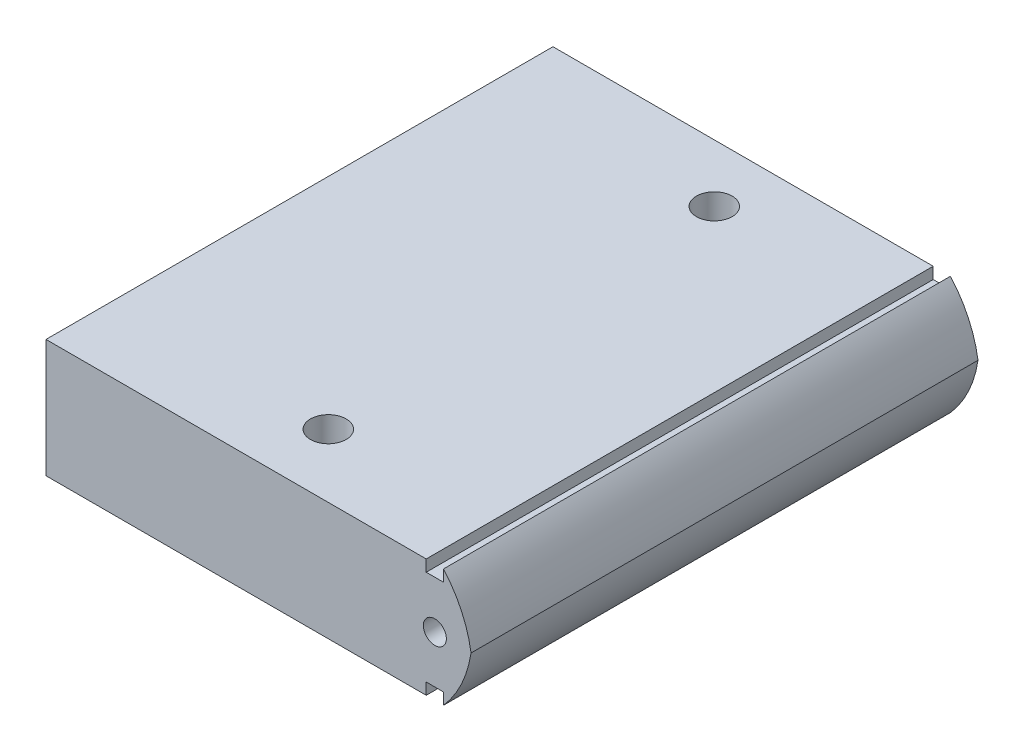
ISO-10303-21;
HEADER;
FILE_DESCRIPTION(('STEP AP214'),'2;1');
FILE_NAME('part.step','',(''),(''),'','','');
FILE_SCHEMA(('AUTOMOTIVE_DESIGN { 1 0 10303 214 1 1 1 1 }'));
ENDSEC;
DATA;
#1=APPLICATION_CONTEXT('core data for automotive mechanical design processes');
#2=APPLICATION_PROTOCOL_DEFINITION('international standard','automotive_design',2000,#1);
#3=PRODUCT_CONTEXT('',#1,'mechanical');
#4=PRODUCT('Part','Part','',(#3));
#5=PRODUCT_RELATED_PRODUCT_CATEGORY('part','',(#4));
#6=PRODUCT_DEFINITION_FORMATION('','',#4);
#7=PRODUCT_DEFINITION_CONTEXT('part definition',#1,'design');
#8=PRODUCT_DEFINITION('design','',#6,#7);
#9=PRODUCT_DEFINITION_SHAPE('','',#8);
#10=(LENGTH_UNIT() NAMED_UNIT(*) SI_UNIT(.MILLI.,.METRE.));
#11=(NAMED_UNIT(*) PLANE_ANGLE_UNIT() SI_UNIT($,.RADIAN.));
#12=(NAMED_UNIT(*) SI_UNIT($,.STERADIAN.) SOLID_ANGLE_UNIT());
#13=UNCERTAINTY_MEASURE_WITH_UNIT(LENGTH_MEASURE(1.E-05),#10,'distance_accuracy_value','');
#14=(GEOMETRIC_REPRESENTATION_CONTEXT(3) GLOBAL_UNCERTAINTY_ASSIGNED_CONTEXT((#13)) GLOBAL_UNIT_ASSIGNED_CONTEXT((#10,
#11,#12)) REPRESENTATION_CONTEXT('',''));
#15=CARTESIAN_POINT('',(0.,0.,0.));
#16=DIRECTION('',(0.,0.,1.));
#17=DIRECTION('',(1.,0.,0.));
#18=AXIS2_PLACEMENT_3D('',#15,#16,#17);
#19=CARTESIAN_POINT('',(0.,10.25,0.));
#20=DIRECTION('',(0.,-1.,0.));
#21=DIRECTION('',(0.,0.,-1.));
#22=AXIS2_PLACEMENT_3D('',#19,#20,#21);
#23=PLANE('',#22);
#24=CARTESIAN_POINT('',(19.,10.25,-5.50000000000001));
#25=DIRECTION('',(0.,1.,0.));
#26=DIRECTION('',(0.,0.,1.));
#27=AXIS2_PLACEMENT_3D('',#24,#25,#26);
#28=CIRCLE('',#27,1.55);
#29=CARTESIAN_POINT('',(19.,10.25,-3.95000000000001));
#30=VERTEX_POINT('',#29);
#31=EDGE_CURVE('E234',#30,#30,#28,.T.);
#32=ORIENTED_EDGE('',*,*,#31,.F.);
#33=EDGE_LOOP('',(#32));
#34=FACE_BOUND('',#33,.T.);
#35=CARTESIAN_POINT('',(19.,10.25,-39.));
#36=DIRECTION('',(0.,1.,0.));
#37=DIRECTION('',(0.,0.,1.));
#38=AXIS2_PLACEMENT_3D('',#35,#36,#37);
#39=CIRCLE('',#38,1.55);
#40=CARTESIAN_POINT('',(19.,10.25,-37.45));
#41=VERTEX_POINT('',#40);
#42=EDGE_CURVE('E242',#41,#41,#39,.T.);
#43=ORIENTED_EDGE('',*,*,#42,.F.);
#44=EDGE_LOOP('',(#43));
#45=FACE_BOUND('',#44,.T.);
#46=DIRECTION('',(1.,0.,0.));
#47=VECTOR('',#46,1.);
#48=CARTESIAN_POINT('',(0.,10.25,0.));
#49=LINE('',#48,#47);
#50=CARTESIAN_POINT('',(0.,10.25,0.));
#51=VERTEX_POINT('',#50);
#52=CARTESIAN_POINT('',(33.,10.25,0.));
#53=VERTEX_POINT('',#52);
#54=EDGE_CURVE('E257',#51,#53,#49,.T.);
#55=ORIENTED_EDGE('',*,*,#54,.T.);
#56=DIRECTION('',(0.,0.,1.));
#57=VECTOR('',#56,1.);
#58=CARTESIAN_POINT('',(33.,10.25,-44.));
#59=LINE('',#58,#57);
#60=CARTESIAN_POINT('',(33.,10.25,-44.));
#61=VERTEX_POINT('',#60);
#62=EDGE_CURVE('E209',#61,#53,#59,.T.);
#63=ORIENTED_EDGE('',*,*,#62,.F.);
#64=DIRECTION('',(-1.,0.,0.));
#65=VECTOR('',#64,1.);
#66=CARTESIAN_POINT('',(0.,10.25,-44.));
#67=LINE('',#66,#65);
#68=CARTESIAN_POINT('',(0.,10.25,-44.));
#69=VERTEX_POINT('',#68);
#70=EDGE_CURVE('E261',#61,#69,#67,.T.);
#71=ORIENTED_EDGE('',*,*,#70,.T.);
#72=DIRECTION('',(0.,0.,1.));
#73=VECTOR('',#72,1.);
#74=CARTESIAN_POINT('',(0.,10.25,0.));
#75=LINE('',#74,#73);
#76=EDGE_CURVE('E254',#69,#51,#75,.T.);
#77=ORIENTED_EDGE('',*,*,#76,.T.);
#78=EDGE_LOOP('',(#55,#63,#71,#77));
#79=FACE_BOUND('',#78,.T.);
#80=ADVANCED_FACE('F33',(#34,#45,#79),#23,.F.);
#81=CARTESIAN_POINT('',(0.,10.25,0.));
#82=DIRECTION('',(1.,0.,0.));
#83=DIRECTION('',(0.,0.,-1.));
#84=AXIS2_PLACEMENT_3D('',#81,#82,#83);
#85=PLANE('',#84);
#86=DIRECTION('',(0.,0.,1.));
#87=VECTOR('',#86,1.);
#88=CARTESIAN_POINT('',(0.,4.25,-34.));
#89=LINE('',#88,#87);
#90=CARTESIAN_POINT('',(0.,4.25,-34.));
#91=VERTEX_POINT('',#90);
#92=CARTESIAN_POINT('',(0.,4.25,-12.));
#93=VERTEX_POINT('',#92);
#94=EDGE_CURVE('E173',#91,#93,#89,.T.);
#95=ORIENTED_EDGE('',*,*,#94,.F.);
#96=DIRECTION('',(0.,-1.,0.));
#97=VECTOR('',#96,1.);
#98=CARTESIAN_POINT('',(0.,9.25,-34.));
#99=LINE('',#98,#97);
#100=CARTESIAN_POINT('',(0.,9.25,-34.));
#101=VERTEX_POINT('',#100);
#102=EDGE_CURVE('E147',#101,#91,#99,.T.);
#103=ORIENTED_EDGE('',*,*,#102,.F.);
#104=DIRECTION('',(0.,0.,-1.));
#105=VECTOR('',#104,1.);
#106=CARTESIAN_POINT('',(0.,9.25,-34.));
#107=LINE('',#106,#105);
#108=CARTESIAN_POINT('',(0.,9.25,-12.));
#109=VERTEX_POINT('',#108);
#110=EDGE_CURVE('E164',#109,#101,#107,.T.);
#111=ORIENTED_EDGE('',*,*,#110,.F.);
#112=DIRECTION('',(0.,1.,0.));
#113=VECTOR('',#112,1.);
#114=CARTESIAN_POINT('',(0.,9.25,-12.));
#115=LINE('',#114,#113);
#116=EDGE_CURVE('E167',#93,#109,#115,.T.);
#117=ORIENTED_EDGE('',*,*,#116,.F.);
#118=EDGE_LOOP('',(#95,#103,#111,#117));
#119=FACE_BOUND('',#118,.T.);
#120=DIRECTION('',(0.,0.,1.));
#121=VECTOR('',#120,1.);
#122=CARTESIAN_POINT('',(0.,0.,0.));
#123=LINE('',#122,#121);
#124=CARTESIAN_POINT('',(0.,0.,-44.));
#125=VERTEX_POINT('',#124);
#126=CARTESIAN_POINT('',(0.,0.,0.));
#127=VERTEX_POINT('',#126);
#128=EDGE_CURVE('E249',#125,#127,#123,.T.);
#129=ORIENTED_EDGE('',*,*,#128,.T.);
#130=DIRECTION('',(0.,-1.,0.));
#131=VECTOR('',#130,1.);
#132=CARTESIAN_POINT('',(0.,10.25,0.));
#133=LINE('',#132,#131);
#134=EDGE_CURVE('E272',#51,#127,#133,.T.);
#135=ORIENTED_EDGE('',*,*,#134,.F.);
#136=ORIENTED_EDGE('',*,*,#76,.F.);
#137=DIRECTION('',(0.,-1.,0.));
#138=VECTOR('',#137,1.);
#139=CARTESIAN_POINT('',(0.,10.25,-44.));
#140=LINE('',#139,#138);
#141=EDGE_CURVE('E263',#69,#125,#140,.T.);
#142=ORIENTED_EDGE('',*,*,#141,.T.);
#143=EDGE_LOOP('',(#129,#135,#136,#142));
#144=FACE_BOUND('',#143,.T.);
#145=ADVANCED_FACE('F308',(#119,#144),#85,.F.);
#146=CARTESIAN_POINT('',(0.,10.25,0.));
#147=DIRECTION('',(0.,0.,-1.));
#148=DIRECTION('',(-1.,0.,0.));
#149=AXIS2_PLACEMENT_3D('',#146,#147,#148);
#150=PLANE('',#149);
#151=CARTESIAN_POINT('',(33.75,5.125,0.));
#152=DIRECTION('',(0.,0.,-1.));
#153=DIRECTION('',(-1.,0.,0.));
#154=AXIS2_PLACEMENT_3D('',#151,#152,#153);
#155=CIRCLE('',#154,0.999999999999998);
#156=CARTESIAN_POINT('',(32.75,5.125,0.));
#157=VERTEX_POINT('',#156);
#158=EDGE_CURVE('E185',#157,#157,#155,.F.);
#159=ORIENTED_EDGE('',*,*,#158,.F.);
#160=EDGE_LOOP('',(#159));
#161=FACE_BOUND('',#160,.T.);
#162=DIRECTION('',(0.,-1.,0.));
#163=VECTOR('',#162,1.);
#164=CARTESIAN_POINT('',(34.5,1.,0.));
#165=LINE('',#164,#163);
#166=CARTESIAN_POINT('',(34.5,1.,0.));
#167=VERTEX_POINT('',#166);
#168=CARTESIAN_POINT('',(34.5,0.,0.));
#169=VERTEX_POINT('',#168);
#170=EDGE_CURVE('E202',#167,#169,#165,.T.);
#171=ORIENTED_EDGE('',*,*,#170,.T.);
#172=CARTESIAN_POINT('',(27.,6.61437827766148,0.));
#173=DIRECTION('',(0.,0.,-1.));
#174=DIRECTION('',(-1.,0.,0.));
#175=AXIS2_PLACEMENT_3D('',#172,#173,#174);
#176=CIRCLE('',#175,10.);
#177=CARTESIAN_POINT('',(36.8884656214213,5.125,0.));
#178=VERTEX_POINT('',#177);
#179=EDGE_CURVE('E11',#169,#178,#176,.F.);
#180=ORIENTED_EDGE('',*,*,#179,.T.);
#181=CARTESIAN_POINT('',(27.,3.63562172233852,0.));
#182=DIRECTION('',(0.,0.,-1.));
#183=DIRECTION('',(-1.,0.,0.));
#184=AXIS2_PLACEMENT_3D('',#181,#182,#183);
#185=CIRCLE('',#184,10.);
#186=CARTESIAN_POINT('',(34.5,10.25,0.));
#187=VERTEX_POINT('',#186);
#188=EDGE_CURVE('E42',#178,#187,#185,.F.);
#189=ORIENTED_EDGE('',*,*,#188,.T.);
#190=DIRECTION('',(0.,1.,0.));
#191=VECTOR('',#190,1.);
#192=CARTESIAN_POINT('',(34.5,9.25,0.));
#193=LINE('',#192,#191);
#194=CARTESIAN_POINT('',(34.5,9.25,0.));
#195=VERTEX_POINT('',#194);
#196=EDGE_CURVE('E237',#195,#187,#193,.T.);
#197=ORIENTED_EDGE('',*,*,#196,.F.);
#198=DIRECTION('',(1.,0.,0.));
#199=VECTOR('',#198,1.);
#200=CARTESIAN_POINT('',(33.,9.25,0.));
#201=LINE('',#200,#199);
#202=CARTESIAN_POINT('',(33.,9.25,0.));
#203=VERTEX_POINT('',#202);
#204=EDGE_CURVE('E219',#203,#195,#201,.T.);
#205=ORIENTED_EDGE('',*,*,#204,.F.);
#206=DIRECTION('',(0.,1.,0.));
#207=VECTOR('',#206,1.);
#208=CARTESIAN_POINT('',(33.,9.25,0.));
#209=LINE('',#208,#207);
#210=EDGE_CURVE('E229',#203,#53,#209,.T.);
#211=ORIENTED_EDGE('',*,*,#210,.T.);
#212=ORIENTED_EDGE('',*,*,#54,.F.);
#213=ORIENTED_EDGE('',*,*,#134,.T.);
#214=DIRECTION('',(1.,0.,0.));
#215=VECTOR('',#214,1.);
#216=CARTESIAN_POINT('',(0.,0.,0.));
#217=LINE('',#216,#215);
#218=CARTESIAN_POINT('',(33.,0.,0.));
#219=VERTEX_POINT('',#218);
#220=EDGE_CURVE('E266',#127,#219,#217,.T.);
#221=ORIENTED_EDGE('',*,*,#220,.T.);
#222=DIRECTION('',(0.,-1.,0.));
#223=VECTOR('',#222,1.);
#224=CARTESIAN_POINT('',(33.,1.,0.));
#225=LINE('',#224,#223);
#226=CARTESIAN_POINT('',(33.,1.,0.));
#227=VERTEX_POINT('',#226);
#228=EDGE_CURVE('E213',#227,#219,#225,.T.);
#229=ORIENTED_EDGE('',*,*,#228,.F.);
#230=DIRECTION('',(-1.,0.,0.));
#231=VECTOR('',#230,1.);
#232=CARTESIAN_POINT('',(34.5,1.,0.));
#233=LINE('',#232,#231);
#234=EDGE_CURVE('E192',#167,#227,#233,.T.);
#235=ORIENTED_EDGE('',*,*,#234,.F.);
#236=EDGE_LOOP('',(#171,#180,#189,#197,#205,#211,#212,#213,#221,#229,#235));
#237=FACE_BOUND('',#236,.T.);
#238=ADVANCED_FACE('F279',(#161,#237),#150,.F.);
#239=CARTESIAN_POINT('',(0.,10.25,-44.));
#240=DIRECTION('',(0.,0.,1.));
#241=DIRECTION('',(1.,0.,0.));
#242=AXIS2_PLACEMENT_3D('',#239,#240,#241);
#243=PLANE('',#242);
#244=CARTESIAN_POINT('',(33.75,5.125,-44.));
#245=DIRECTION('',(0.,0.,-1.));
#246=DIRECTION('',(-1.,0.,0.));
#247=AXIS2_PLACEMENT_3D('',#244,#245,#246);
#248=CIRCLE('',#247,0.999999999999998);
#249=CARTESIAN_POINT('',(32.75,5.125,-44.));
#250=VERTEX_POINT('',#249);
#251=EDGE_CURVE('E179',#250,#250,#248,.T.);
#252=ORIENTED_EDGE('',*,*,#251,.F.);
#253=EDGE_LOOP('',(#252));
#254=FACE_BOUND('',#253,.T.);
#255=CARTESIAN_POINT('',(27.,3.63562172233852,-44.));
#256=DIRECTION('',(0.,0.,1.));
#257=DIRECTION('',(1.,0.,0.));
#258=AXIS2_PLACEMENT_3D('',#255,#256,#257);
#259=CIRCLE('',#258,10.);
#260=CARTESIAN_POINT('',(34.5,10.25,-44.));
#261=VERTEX_POINT('',#260);
#262=CARTESIAN_POINT('',(36.8884656214213,5.12499999999998,-44.));
#263=VERTEX_POINT('',#262);
#264=EDGE_CURVE('E55',#261,#263,#259,.F.);
#265=ORIENTED_EDGE('',*,*,#264,.T.);
#266=CARTESIAN_POINT('',(27.,6.61437827766148,-44.));
#267=DIRECTION('',(0.,0.,1.));
#268=DIRECTION('',(1.,0.,0.));
#269=AXIS2_PLACEMENT_3D('',#266,#267,#268);
#270=CIRCLE('',#269,10.);
#271=CARTESIAN_POINT('',(34.5,0.,-44.));
#272=VERTEX_POINT('',#271);
#273=EDGE_CURVE('E276',#263,#272,#270,.F.);
#274=ORIENTED_EDGE('',*,*,#273,.T.);
#275=DIRECTION('',(0.,-1.,0.));
#276=VECTOR('',#275,1.);
#277=CARTESIAN_POINT('',(34.5,1.,-44.));
#278=LINE('',#277,#276);
#279=CARTESIAN_POINT('',(34.5,1.,-44.));
#280=VERTEX_POINT('',#279);
#281=EDGE_CURVE('E206',#280,#272,#278,.T.);
#282=ORIENTED_EDGE('',*,*,#281,.F.);
#283=DIRECTION('',(1.,0.,0.));
#284=VECTOR('',#283,1.);
#285=CARTESIAN_POINT('',(34.5,1.,-44.));
#286=LINE('',#285,#284);
#287=CARTESIAN_POINT('',(33.,1.,-44.));
#288=VERTEX_POINT('',#287);
#289=EDGE_CURVE('E199',#288,#280,#286,.T.);
#290=ORIENTED_EDGE('',*,*,#289,.F.);
#291=DIRECTION('',(0.,-1.,0.));
#292=VECTOR('',#291,1.);
#293=CARTESIAN_POINT('',(33.,1.,-44.));
#294=LINE('',#293,#292);
#295=CARTESIAN_POINT('',(33.,0.,-44.));
#296=VERTEX_POINT('',#295);
#297=EDGE_CURVE('E210',#288,#296,#294,.T.);
#298=ORIENTED_EDGE('',*,*,#297,.T.);
#299=DIRECTION('',(-1.,0.,0.));
#300=VECTOR('',#299,1.);
#301=CARTESIAN_POINT('',(0.,0.,-44.));
#302=LINE('',#301,#300);
#303=EDGE_CURVE('E258',#296,#125,#302,.T.);
#304=ORIENTED_EDGE('',*,*,#303,.T.);
#305=ORIENTED_EDGE('',*,*,#141,.F.);
#306=ORIENTED_EDGE('',*,*,#70,.F.);
#307=DIRECTION('',(0.,1.,0.));
#308=VECTOR('',#307,1.);
#309=CARTESIAN_POINT('',(33.,9.25,-44.));
#310=LINE('',#309,#308);
#311=CARTESIAN_POINT('',(33.,9.25,-44.));
#312=VERTEX_POINT('',#311);
#313=EDGE_CURVE('E232',#312,#61,#310,.T.);
#314=ORIENTED_EDGE('',*,*,#313,.F.);
#315=DIRECTION('',(-1.,0.,0.));
#316=VECTOR('',#315,1.);
#317=CARTESIAN_POINT('',(33.,9.25,-44.));
#318=LINE('',#317,#316);
#319=CARTESIAN_POINT('',(34.5,9.25,-44.));
#320=VERTEX_POINT('',#319);
#321=EDGE_CURVE('E226',#320,#312,#318,.T.);
#322=ORIENTED_EDGE('',*,*,#321,.F.);
#323=DIRECTION('',(0.,1.,0.));
#324=VECTOR('',#323,1.);
#325=CARTESIAN_POINT('',(34.5,9.25,-44.));
#326=LINE('',#325,#324);
#327=EDGE_CURVE('E235',#320,#261,#326,.T.);
#328=ORIENTED_EDGE('',*,*,#327,.T.);
#329=EDGE_LOOP('',(#265,#274,#282,#290,#298,#304,#305,#306,#314,#322,#328));
#330=FACE_BOUND('',#329,.T.);
#331=ADVANCED_FACE('F291',(#254,#330),#243,.F.);
#332=CARTESIAN_POINT('',(0.,0.,0.));
#333=DIRECTION('',(0.,-1.,0.));
#334=DIRECTION('',(0.,0.,-1.));
#335=AXIS2_PLACEMENT_3D('',#332,#333,#334);
#336=PLANE('',#335);
#337=DIRECTION('',(0.,0.,-1.));
#338=VECTOR('',#337,1.);
#339=CARTESIAN_POINT('',(33.,0.,-44.));
#340=LINE('',#339,#338);
#341=EDGE_CURVE('E193',#219,#296,#340,.T.);
#342=ORIENTED_EDGE('',*,*,#341,.F.);
#343=ORIENTED_EDGE('',*,*,#220,.F.);
#344=ORIENTED_EDGE('',*,*,#128,.F.);
#345=ORIENTED_EDGE('',*,*,#303,.F.);
#346=EDGE_LOOP('',(#342,#343,#344,#345));
#347=FACE_BOUND('',#346,.T.);
#348=CARTESIAN_POINT('',(19.,0.,-39.));
#349=DIRECTION('',(0.,-1.,0.));
#350=DIRECTION('',(0.,0.,-1.));
#351=AXIS2_PLACEMENT_3D('',#348,#349,#350);
#352=CIRCLE('',#351,1.55);
#353=CARTESIAN_POINT('',(19.,0.,-40.55));
#354=VERTEX_POINT('',#353);
#355=EDGE_CURVE('E245',#354,#354,#352,.F.);
#356=ORIENTED_EDGE('',*,*,#355,.T.);
#357=EDGE_LOOP('',(#356));
#358=FACE_BOUND('',#357,.T.);
#359=CARTESIAN_POINT('',(19.,0.,-5.50000000000001));
#360=DIRECTION('',(0.,-1.,0.));
#361=DIRECTION('',(0.,0.,-1.));
#362=AXIS2_PLACEMENT_3D('',#359,#360,#361);
#363=CIRCLE('',#362,1.55);
#364=CARTESIAN_POINT('',(19.,0.,-7.05));
#365=VERTEX_POINT('',#364);
#366=EDGE_CURVE('E246',#365,#365,#363,.F.);
#367=ORIENTED_EDGE('',*,*,#366,.T.);
#368=EDGE_LOOP('',(#367));
#369=FACE_BOUND('',#368,.T.);
#370=ADVANCED_FACE('F304',(#347,#358,#369),#336,.T.);
#371=CARTESIAN_POINT('',(19.,-4.38406204335659,-5.50000000000001));
#372=DIRECTION('',(0.,1.,0.));
#373=DIRECTION('',(0.,0.,1.));
#374=AXIS2_PLACEMENT_3D('',#371,#372,#373);
#375=CYLINDRICAL_SURFACE('',#374,1.55);
#376=ORIENTED_EDGE('',*,*,#31,.T.);
#377=EDGE_LOOP('',(#376));
#378=FACE_BOUND('',#377,.T.);
#379=ORIENTED_EDGE('',*,*,#366,.F.);
#380=EDGE_LOOP('',(#379));
#381=FACE_BOUND('',#380,.T.);
#382=ADVANCED_FACE('F340',(#378,#381),#375,.F.);
#383=CARTESIAN_POINT('',(19.,-4.38406204335659,-39.));
#384=DIRECTION('',(0.,1.,0.));
#385=DIRECTION('',(0.,0.,1.));
#386=AXIS2_PLACEMENT_3D('',#383,#384,#385);
#387=CYLINDRICAL_SURFACE('',#386,1.55);
#388=ORIENTED_EDGE('',*,*,#42,.T.);
#389=EDGE_LOOP('',(#388));
#390=FACE_BOUND('',#389,.T.);
#391=ORIENTED_EDGE('',*,*,#355,.F.);
#392=EDGE_LOOP('',(#391));
#393=FACE_BOUND('',#392,.T.);
#394=ADVANCED_FACE('F479',(#390,#393),#387,.F.);
#395=CARTESIAN_POINT('',(33.,9.25,-44.));
#396=DIRECTION('',(-1.,0.,0.));
#397=DIRECTION('',(0.,0.,1.));
#398=AXIS2_PLACEMENT_3D('',#395,#396,#397);
#399=PLANE('',#398);
#400=ORIENTED_EDGE('',*,*,#62,.T.);
#401=ORIENTED_EDGE('',*,*,#210,.F.);
#402=DIRECTION('',(0.,0.,1.));
#403=VECTOR('',#402,1.);
#404=CARTESIAN_POINT('',(33.,9.25,-44.));
#405=LINE('',#404,#403);
#406=EDGE_CURVE('E216',#312,#203,#405,.T.);
#407=ORIENTED_EDGE('',*,*,#406,.F.);
#408=ORIENTED_EDGE('',*,*,#313,.T.);
#409=EDGE_LOOP('',(#400,#401,#407,#408));
#410=FACE_BOUND('',#409,.T.);
#411=ADVANCED_FACE('F316',(#410),#399,.F.);
#412=CARTESIAN_POINT('',(34.5,9.25,-44.));
#413=DIRECTION('',(1.,0.,0.));
#414=DIRECTION('',(0.,0.,-1.));
#415=AXIS2_PLACEMENT_3D('',#412,#413,#414);
#416=PLANE('',#415);
#417=DIRECTION('',(0.,0.,-1.));
#418=VECTOR('',#417,1.);
#419=CARTESIAN_POINT('',(34.5,10.25,-44.));
#420=LINE('',#419,#418);
#421=EDGE_CURVE('E220',#187,#261,#420,.T.);
#422=ORIENTED_EDGE('',*,*,#421,.T.);
#423=ORIENTED_EDGE('',*,*,#327,.F.);
#424=DIRECTION('',(0.,0.,-1.));
#425=VECTOR('',#424,1.);
#426=CARTESIAN_POINT('',(34.5,9.25,-44.));
#427=LINE('',#426,#425);
#428=EDGE_CURVE('E223',#195,#320,#427,.T.);
#429=ORIENTED_EDGE('',*,*,#428,.F.);
#430=ORIENTED_EDGE('',*,*,#196,.T.);
#431=EDGE_LOOP('',(#422,#423,#429,#430));
#432=FACE_BOUND('',#431,.T.);
#433=ADVANCED_FACE('F285',(#432),#416,.F.);
#434=CARTESIAN_POINT('',(0.,9.25,0.));
#435=DIRECTION('',(0.,1.,0.));
#436=DIRECTION('',(0.,0.,1.));
#437=AXIS2_PLACEMENT_3D('',#434,#435,#436);
#438=PLANE('',#437);
#439=ORIENTED_EDGE('',*,*,#406,.T.);
#440=ORIENTED_EDGE('',*,*,#204,.T.);
#441=ORIENTED_EDGE('',*,*,#428,.T.);
#442=ORIENTED_EDGE('',*,*,#321,.T.);
#443=EDGE_LOOP('',(#439,#440,#441,#442));
#444=FACE_BOUND('',#443,.T.);
#445=ADVANCED_FACE('F318',(#444),#438,.T.);
#446=CARTESIAN_POINT('',(34.5,1.,-44.));
#447=DIRECTION('',(1.,0.,0.));
#448=DIRECTION('',(0.,0.,-1.));
#449=AXIS2_PLACEMENT_3D('',#446,#447,#448);
#450=PLANE('',#449);
#451=DIRECTION('',(0.,0.,1.));
#452=VECTOR('',#451,1.);
#453=CARTESIAN_POINT('',(34.5,0.,-44.));
#454=LINE('',#453,#452);
#455=EDGE_CURVE('E188',#272,#169,#454,.T.);
#456=ORIENTED_EDGE('',*,*,#455,.T.);
#457=ORIENTED_EDGE('',*,*,#170,.F.);
#458=DIRECTION('',(0.,0.,1.));
#459=VECTOR('',#458,1.);
#460=CARTESIAN_POINT('',(34.5,1.,-44.));
#461=LINE('',#460,#459);
#462=EDGE_CURVE('E189',#280,#167,#461,.T.);
#463=ORIENTED_EDGE('',*,*,#462,.F.);
#464=ORIENTED_EDGE('',*,*,#281,.T.);
#465=EDGE_LOOP('',(#456,#457,#463,#464));
#466=FACE_BOUND('',#465,.T.);
#467=ADVANCED_FACE('F294',(#466),#450,.F.);
#468=CARTESIAN_POINT('',(33.,1.,-44.));
#469=DIRECTION('',(-1.,0.,0.));
#470=DIRECTION('',(0.,0.,1.));
#471=AXIS2_PLACEMENT_3D('',#468,#469,#470);
#472=PLANE('',#471);
#473=ORIENTED_EDGE('',*,*,#341,.T.);
#474=ORIENTED_EDGE('',*,*,#297,.F.);
#475=DIRECTION('',(0.,0.,-1.));
#476=VECTOR('',#475,1.);
#477=CARTESIAN_POINT('',(33.,1.,-44.));
#478=LINE('',#477,#476);
#479=EDGE_CURVE('E196',#227,#288,#478,.T.);
#480=ORIENTED_EDGE('',*,*,#479,.F.);
#481=ORIENTED_EDGE('',*,*,#228,.T.);
#482=EDGE_LOOP('',(#473,#474,#480,#481));
#483=FACE_BOUND('',#482,.T.);
#484=ADVANCED_FACE('F325',(#483),#472,.F.);
#485=CARTESIAN_POINT('',(0.,1.,0.));
#486=DIRECTION('',(0.,-1.,0.));
#487=DIRECTION('',(0.,0.,-1.));
#488=AXIS2_PLACEMENT_3D('',#485,#486,#487);
#489=PLANE('',#488);
#490=ORIENTED_EDGE('',*,*,#462,.T.);
#491=ORIENTED_EDGE('',*,*,#234,.T.);
#492=ORIENTED_EDGE('',*,*,#479,.T.);
#493=ORIENTED_EDGE('',*,*,#289,.T.);
#494=EDGE_LOOP('',(#490,#491,#492,#493));
#495=FACE_BOUND('',#494,.T.);
#496=ADVANCED_FACE('F297',(#495),#489,.T.);
#497=CARTESIAN_POINT('',(33.75,5.125,2.82842712474619));
#498=DIRECTION('',(0.,0.,-1.));
#499=DIRECTION('',(-1.,0.,0.));
#500=AXIS2_PLACEMENT_3D('',#497,#498,#499);
#501=CYLINDRICAL_SURFACE('',#500,0.999999999999998);
#502=ORIENTED_EDGE('',*,*,#158,.T.);
#503=EDGE_LOOP('',(#502));
#504=FACE_BOUND('',#503,.T.);
#505=ORIENTED_EDGE('',*,*,#251,.T.);
#506=EDGE_LOOP('',(#505));
#507=FACE_BOUND('',#506,.T.);
#508=ADVANCED_FACE('F372',(#504,#507),#501,.F.);
#509=CARTESIAN_POINT('',(5.,9.25,-34.));
#510=DIRECTION('',(0.,0.,-1.));
#511=DIRECTION('',(-1.,0.,0.));
#512=AXIS2_PLACEMENT_3D('',#509,#510,#511);
#513=PLANE('',#512);
#514=ORIENTED_EDGE('',*,*,#102,.T.);
#515=DIRECTION('',(-1.,0.,0.));
#516=VECTOR('',#515,1.);
#517=CARTESIAN_POINT('',(5.,4.25,-34.));
#518=LINE('',#517,#516);
#519=CARTESIAN_POINT('',(5.,4.25,-34.));
#520=VERTEX_POINT('',#519);
#521=EDGE_CURVE('E140',#520,#91,#518,.T.);
#522=ORIENTED_EDGE('',*,*,#521,.F.);
#523=DIRECTION('',(0.,-1.,0.));
#524=VECTOR('',#523,1.);
#525=CARTESIAN_POINT('',(5.,9.25,-34.));
#526=LINE('',#525,#524);
#527=CARTESIAN_POINT('',(5.,9.25,-34.));
#528=VERTEX_POINT('',#527);
#529=EDGE_CURVE('E144',#528,#520,#526,.T.);
#530=ORIENTED_EDGE('',*,*,#529,.F.);
#531=DIRECTION('',(-1.,0.,0.));
#532=VECTOR('',#531,1.);
#533=CARTESIAN_POINT('',(5.,9.25,-34.));
#534=LINE('',#533,#532);
#535=EDGE_CURVE('E177',#528,#101,#534,.T.);
#536=ORIENTED_EDGE('',*,*,#535,.T.);
#537=EDGE_LOOP('',(#514,#522,#530,#536));
#538=FACE_BOUND('',#537,.T.);
#539=ADVANCED_FACE('F142',(#538),#513,.F.);
#540=CARTESIAN_POINT('',(5.,9.25,-34.));
#541=DIRECTION('',(0.,1.,0.));
#542=DIRECTION('',(0.,0.,1.));
#543=AXIS2_PLACEMENT_3D('',#540,#541,#542);
#544=PLANE('',#543);
#545=ORIENTED_EDGE('',*,*,#110,.T.);
#546=ORIENTED_EDGE('',*,*,#535,.F.);
#547=DIRECTION('',(0.,0.,-1.));
#548=VECTOR('',#547,1.);
#549=CARTESIAN_POINT('',(5.,9.25,-34.));
#550=LINE('',#549,#548);
#551=CARTESIAN_POINT('',(5.,9.25,-12.));
#552=VERTEX_POINT('',#551);
#553=EDGE_CURVE('E152',#552,#528,#550,.T.);
#554=ORIENTED_EDGE('',*,*,#553,.F.);
#555=DIRECTION('',(-1.,0.,0.));
#556=VECTOR('',#555,1.);
#557=CARTESIAN_POINT('',(5.,9.25,-12.));
#558=LINE('',#557,#556);
#559=EDGE_CURVE('E180',#552,#109,#558,.T.);
#560=ORIENTED_EDGE('',*,*,#559,.T.);
#561=EDGE_LOOP('',(#545,#546,#554,#560));
#562=FACE_BOUND('',#561,.T.);
#563=ADVANCED_FACE('F363',(#562),#544,.F.);
#564=CARTESIAN_POINT('',(5.,9.25,-12.));
#565=DIRECTION('',(0.,0.,1.));
#566=DIRECTION('',(1.,0.,0.));
#567=AXIS2_PLACEMENT_3D('',#564,#565,#566);
#568=PLANE('',#567);
#569=ORIENTED_EDGE('',*,*,#116,.T.);
#570=ORIENTED_EDGE('',*,*,#559,.F.);
#571=DIRECTION('',(0.,1.,0.));
#572=VECTOR('',#571,1.);
#573=CARTESIAN_POINT('',(5.,9.25,-12.));
#574=LINE('',#573,#572);
#575=CARTESIAN_POINT('',(5.,4.25,-12.));
#576=VERTEX_POINT('',#575);
#577=EDGE_CURVE('E160',#576,#552,#574,.T.);
#578=ORIENTED_EDGE('',*,*,#577,.F.);
#579=DIRECTION('',(-1.,0.,0.));
#580=VECTOR('',#579,1.);
#581=CARTESIAN_POINT('',(5.,4.25,-12.));
#582=LINE('',#581,#580);
#583=EDGE_CURVE('E151',#576,#93,#582,.T.);
#584=ORIENTED_EDGE('',*,*,#583,.T.);
#585=EDGE_LOOP('',(#569,#570,#578,#584));
#586=FACE_BOUND('',#585,.T.);
#587=ADVANCED_FACE('F360',(#586),#568,.F.);
#588=CARTESIAN_POINT('',(5.,4.25,-34.));
#589=DIRECTION('',(0.,-1.,0.));
#590=DIRECTION('',(0.,0.,-1.));
#591=AXIS2_PLACEMENT_3D('',#588,#589,#590);
#592=PLANE('',#591);
#593=ORIENTED_EDGE('',*,*,#94,.T.);
#594=ORIENTED_EDGE('',*,*,#583,.F.);
#595=DIRECTION('',(0.,0.,1.));
#596=VECTOR('',#595,1.);
#597=CARTESIAN_POINT('',(5.,4.25,-34.));
#598=LINE('',#597,#596);
#599=EDGE_CURVE('E155',#520,#576,#598,.T.);
#600=ORIENTED_EDGE('',*,*,#599,.F.);
#601=ORIENTED_EDGE('',*,*,#521,.T.);
#602=EDGE_LOOP('',(#593,#594,#600,#601));
#603=FACE_BOUND('',#602,.T.);
#604=ADVANCED_FACE('F156',(#603),#592,.F.);
#605=CARTESIAN_POINT('',(5.,0.,0.));
#606=DIRECTION('',(-1.,0.,0.));
#607=DIRECTION('',(0.,0.,1.));
#608=AXIS2_PLACEMENT_3D('',#605,#606,#607);
#609=PLANE('',#608);
#610=ORIENTED_EDGE('',*,*,#529,.T.);
#611=ORIENTED_EDGE('',*,*,#599,.T.);
#612=ORIENTED_EDGE('',*,*,#577,.T.);
#613=ORIENTED_EDGE('',*,*,#553,.T.);
#614=EDGE_LOOP('',(#610,#611,#612,#613));
#615=FACE_BOUND('',#614,.T.);
#616=ADVANCED_FACE('F162',(#615),#609,.T.);
#617=CARTESIAN_POINT('',(27.,3.63562172233852,0.));
#618=DIRECTION('',(0.,0.,1.));
#619=DIRECTION('',(1.,0.,0.));
#620=AXIS2_PLACEMENT_3D('',#617,#618,#619);
#621=CYLINDRICAL_SURFACE('',#620,10.);
#622=ORIENTED_EDGE('',*,*,#421,.F.);
#623=ORIENTED_EDGE('',*,*,#188,.F.);
#624=DIRECTION('',(0.,0.,1.));
#625=VECTOR('',#624,1.);
#626=CARTESIAN_POINT('',(36.8884656214213,5.12499999999999,-22.));
#627=LINE('',#626,#625);
#628=EDGE_CURVE('E37',#263,#178,#627,.T.);
#629=ORIENTED_EDGE('',*,*,#628,.F.);
#630=ORIENTED_EDGE('',*,*,#264,.F.);
#631=EDGE_LOOP('',(#622,#623,#629,#630));
#632=FACE_BOUND('',#631,.T.);
#633=ADVANCED_FACE('F35',(#632),#621,.T.);
#634=CARTESIAN_POINT('',(27.,6.61437827766148,0.));
#635=DIRECTION('',(0.,0.,1.));
#636=DIRECTION('',(1.,0.,0.));
#637=AXIS2_PLACEMENT_3D('',#634,#635,#636);
#638=CYLINDRICAL_SURFACE('',#637,10.);
#639=ORIENTED_EDGE('',*,*,#179,.F.);
#640=ORIENTED_EDGE('',*,*,#455,.F.);
#641=ORIENTED_EDGE('',*,*,#273,.F.);
#642=ORIENTED_EDGE('',*,*,#628,.T.);
#643=EDGE_LOOP('',(#639,#640,#641,#642));
#644=FACE_BOUND('',#643,.T.);
#645=ADVANCED_FACE('F289',(#644),#638,.T.);
#646=CLOSED_SHELL('',(#80,#145,#238,#331,#370,#382,#394,#411,#433,#445,#467,#484,#496,#508,#539,
#563,#587,#604,#616,#633,#645));
#647=MANIFOLD_SOLID_BREP('B2',#646);
#648=ADVANCED_BREP_SHAPE_REPRESENTATION('',(#18,#647),#14);
#649=SHAPE_DEFINITION_REPRESENTATION(#9,#648);
ENDSEC;
END-ISO-10303-21;
